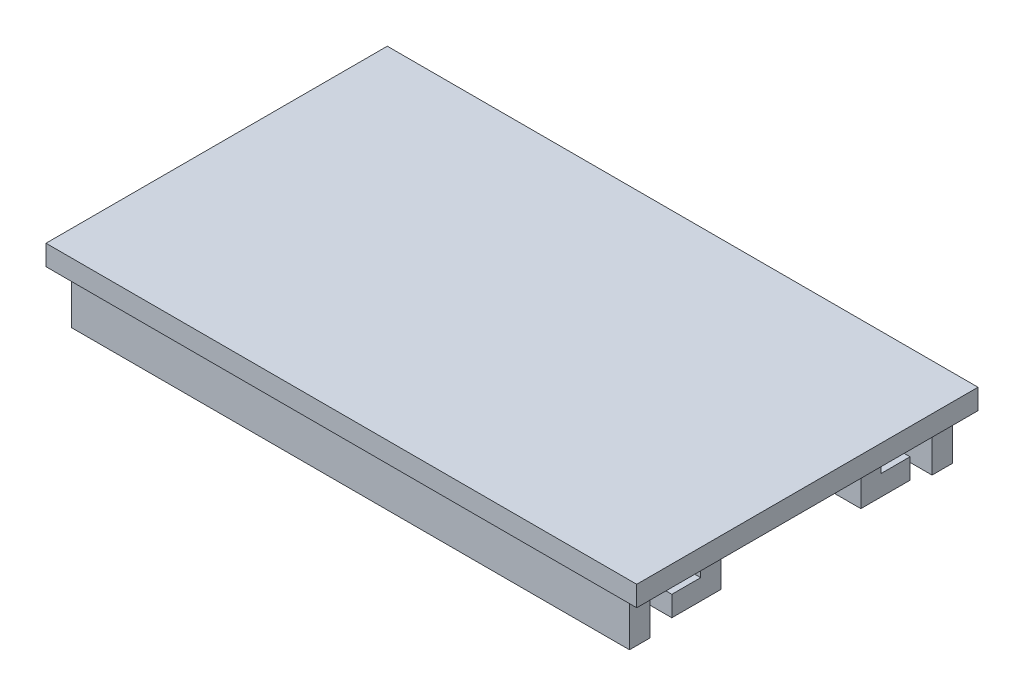
ISO-10303-21;
HEADER;
FILE_DESCRIPTION(('STEP AP214'),'2;1');
FILE_NAME('part.step','',(''),(''),'','','');
FILE_SCHEMA(('AUTOMOTIVE_DESIGN { 1 0 10303 214 1 1 1 1 }'));
ENDSEC;
DATA;
#1=APPLICATION_CONTEXT('core data for automotive mechanical design processes');
#2=APPLICATION_PROTOCOL_DEFINITION('international standard','automotive_design',2000,#1);
#3=PRODUCT_CONTEXT('',#1,'mechanical');
#4=PRODUCT('Part','Part','',(#3));
#5=PRODUCT_RELATED_PRODUCT_CATEGORY('part','',(#4));
#6=PRODUCT_DEFINITION_FORMATION('','',#4);
#7=PRODUCT_DEFINITION_CONTEXT('part definition',#1,'design');
#8=PRODUCT_DEFINITION('design','',#6,#7);
#9=PRODUCT_DEFINITION_SHAPE('','',#8);
#10=(LENGTH_UNIT() NAMED_UNIT(*) SI_UNIT(.MILLI.,.METRE.));
#11=(NAMED_UNIT(*) PLANE_ANGLE_UNIT() SI_UNIT($,.RADIAN.));
#12=(NAMED_UNIT(*) SI_UNIT($,.STERADIAN.) SOLID_ANGLE_UNIT());
#13=UNCERTAINTY_MEASURE_WITH_UNIT(LENGTH_MEASURE(1.E-05),#10,'distance_accuracy_value','');
#14=(GEOMETRIC_REPRESENTATION_CONTEXT(3) GLOBAL_UNCERTAINTY_ASSIGNED_CONTEXT((#13)) GLOBAL_UNIT_ASSIGNED_CONTEXT((#10,
#11,#12)) REPRESENTATION_CONTEXT('',''));
#15=CARTESIAN_POINT('',(0.,0.,0.));
#16=DIRECTION('',(0.,0.,1.));
#17=DIRECTION('',(1.,0.,0.));
#18=AXIS2_PLACEMENT_3D('',#15,#16,#17);
#19=CARTESIAN_POINT('',(0.,0.,0.));
#20=DIRECTION('',(0.,1.,0.));
#21=DIRECTION('',(0.,0.,1.));
#22=AXIS2_PLACEMENT_3D('',#19,#20,#21);
#23=PLANE('',#22);
#24=DIRECTION('',(0.,0.,1.));
#25=VECTOR('',#24,1.);
#26=CARTESIAN_POINT('',(85.,0.,0.));
#27=LINE('',#26,#25);
#28=CARTESIAN_POINT('',(85.,0.,-27.5));
#29=VERTEX_POINT('',#28);
#30=CARTESIAN_POINT('',(85.,0.,-21.3));
#31=VERTEX_POINT('',#30);
#32=EDGE_CURVE('E244',#29,#31,#27,.T.);
#33=ORIENTED_EDGE('',*,*,#32,.F.);
#34=DIRECTION('',(1.,0.,0.));
#35=VECTOR('',#34,1.);
#36=CARTESIAN_POINT('',(-109.849433241279,0.,-27.5));
#37=LINE('',#36,#35);
#38=CARTESIAN_POINT('',(-85.,0.,-27.5));
#39=VERTEX_POINT('',#38);
#40=EDGE_CURVE('E268',#39,#29,#37,.T.);
#41=ORIENTED_EDGE('',*,*,#40,.F.);
#42=DIRECTION('',(0.,0.,-1.));
#43=VECTOR('',#42,1.);
#44=CARTESIAN_POINT('',(-85.,0.,0.));
#45=LINE('',#44,#43);
#46=CARTESIAN_POINT('',(-85.,0.,-21.3));
#47=VERTEX_POINT('',#46);
#48=EDGE_CURVE('E234',#47,#39,#45,.T.);
#49=ORIENTED_EDGE('',*,*,#48,.F.);
#50=DIRECTION('',(1.,0.,0.));
#51=VECTOR('',#50,1.);
#52=CARTESIAN_POINT('',(-109.849433241279,0.,-21.3));
#53=LINE('',#52,#51);
#54=EDGE_CURVE('E230',#47,#31,#53,.T.);
#55=ORIENTED_EDGE('',*,*,#54,.T.);
#56=EDGE_LOOP('',(#33,#41,#49,#55));
#57=FACE_BOUND('',#56,.T.);
#58=DIRECTION('',(0.,0.,1.));
#59=VECTOR('',#58,1.);
#60=CARTESIAN_POINT('',(85.,1.5955765127149E-13,0.));
#61=LINE('',#60,#59);
#62=CARTESIAN_POINT('',(85.,0.,43.));
#63=VERTEX_POINT('',#62);
#64=CARTESIAN_POINT('',(85.,0.,49.2));
#65=VERTEX_POINT('',#64);
#66=EDGE_CURVE('E289',#63,#65,#61,.T.);
#67=ORIENTED_EDGE('',*,*,#66,.F.);
#68=DIRECTION('',(1.,0.,0.));
#69=VECTOR('',#68,1.);
#70=CARTESIAN_POINT('',(-109.849433241279,0.,43.));
#71=LINE('',#70,#69);
#72=CARTESIAN_POINT('',(-85.,0.,43.));
#73=VERTEX_POINT('',#72);
#74=EDGE_CURVE('E324',#73,#63,#71,.T.);
#75=ORIENTED_EDGE('',*,*,#74,.F.);
#76=DIRECTION('',(0.,0.,-1.));
#77=VECTOR('',#76,1.);
#78=CARTESIAN_POINT('',(-85.,1.5955765127149E-13,0.));
#79=LINE('',#78,#77);
#80=CARTESIAN_POINT('',(-85.,0.,49.2));
#81=VERTEX_POINT('',#80);
#82=EDGE_CURVE('E326',#81,#73,#79,.T.);
#83=ORIENTED_EDGE('',*,*,#82,.F.);
#84=DIRECTION('',(1.,0.,0.));
#85=VECTOR('',#84,1.);
#86=CARTESIAN_POINT('',(-109.849433241279,0.,49.2));
#87=LINE('',#86,#85);
#88=EDGE_CURVE('E341',#81,#65,#87,.T.);
#89=ORIENTED_EDGE('',*,*,#88,.T.);
#90=EDGE_LOOP('',(#67,#75,#83,#89));
#91=FACE_BOUND('',#90,.T.);
#92=DIRECTION('',(0.,0.,1.));
#93=VECTOR('',#92,1.);
#94=CARTESIAN_POINT('',(-90.,0.,-52.));
#95=LINE('',#94,#93);
#96=CARTESIAN_POINT('',(-90.,0.,-52.));
#97=VERTEX_POINT('',#96);
#98=CARTESIAN_POINT('',(-90.,0.,52.));
#99=VERTEX_POINT('',#98);
#100=EDGE_CURVE('E351',#97,#99,#95,.T.);
#101=ORIENTED_EDGE('',*,*,#100,.F.);
#102=DIRECTION('',(-1.,0.,0.));
#103=VECTOR('',#102,1.);
#104=CARTESIAN_POINT('',(-90.,0.,-52.));
#105=LINE('',#104,#103);
#106=CARTESIAN_POINT('',(90.,0.,-52.));
#107=VERTEX_POINT('',#106);
#108=EDGE_CURVE('E356',#107,#97,#105,.T.);
#109=ORIENTED_EDGE('',*,*,#108,.F.);
#110=DIRECTION('',(0.,0.,-1.));
#111=VECTOR('',#110,1.);
#112=CARTESIAN_POINT('',(90.,0.,-52.));
#113=LINE('',#112,#111);
#114=CARTESIAN_POINT('',(90.,0.,52.));
#115=VERTEX_POINT('',#114);
#116=EDGE_CURVE('E367',#115,#107,#113,.T.);
#117=ORIENTED_EDGE('',*,*,#116,.F.);
#118=DIRECTION('',(1.,0.,0.));
#119=VECTOR('',#118,1.);
#120=CARTESIAN_POINT('',(-90.,0.,52.));
#121=LINE('',#120,#119);
#122=EDGE_CURVE('E365',#99,#115,#121,.T.);
#123=ORIENTED_EDGE('',*,*,#122,.F.);
#124=EDGE_LOOP('',(#101,#109,#117,#123));
#125=FACE_BOUND('',#124,.T.);
#126=DIRECTION('',(0.,0.,-1.));
#127=VECTOR('',#126,1.);
#128=CARTESIAN_POINT('',(85.,0.,0.));
#129=LINE('',#128,#127);
#130=CARTESIAN_POINT('',(85.,0.,27.5));
#131=VERTEX_POINT('',#130);
#132=CARTESIAN_POINT('',(85.,0.,21.3));
#133=VERTEX_POINT('',#132);
#134=EDGE_CURVE('E295',#131,#133,#129,.T.);
#135=ORIENTED_EDGE('',*,*,#134,.T.);
#136=DIRECTION('',(1.,0.,0.));
#137=VECTOR('',#136,1.);
#138=CARTESIAN_POINT('',(-109.849433241279,0.,21.3));
#139=LINE('',#138,#137);
#140=CARTESIAN_POINT('',(-85.,0.,21.3));
#141=VERTEX_POINT('',#140);
#142=EDGE_CURVE('E312',#141,#133,#139,.T.);
#143=ORIENTED_EDGE('',*,*,#142,.F.);
#144=DIRECTION('',(0.,0.,1.));
#145=VECTOR('',#144,1.);
#146=CARTESIAN_POINT('',(-85.,0.,0.));
#147=LINE('',#146,#145);
#148=CARTESIAN_POINT('',(-85.,0.,27.5));
#149=VERTEX_POINT('',#148);
#150=EDGE_CURVE('E281',#141,#149,#147,.T.);
#151=ORIENTED_EDGE('',*,*,#150,.T.);
#152=DIRECTION('',(1.,0.,0.));
#153=VECTOR('',#152,1.);
#154=CARTESIAN_POINT('',(-109.849433241279,0.,27.5));
#155=LINE('',#154,#153);
#156=EDGE_CURVE('E315',#149,#131,#155,.T.);
#157=ORIENTED_EDGE('',*,*,#156,.T.);
#158=EDGE_LOOP('',(#135,#143,#151,#157));
#159=FACE_BOUND('',#158,.T.);
#160=DIRECTION('',(0.,0.,1.));
#161=VECTOR('',#160,1.);
#162=CARTESIAN_POINT('',(85.,0.,0.));
#163=LINE('',#162,#161);
#164=CARTESIAN_POINT('',(85.,0.,-49.2));
#165=VERTEX_POINT('',#164);
#166=CARTESIAN_POINT('',(85.,0.,-43.));
#167=VERTEX_POINT('',#166);
#168=EDGE_CURVE('E56',#165,#167,#163,.T.);
#169=ORIENTED_EDGE('',*,*,#168,.F.);
#170=DIRECTION('',(1.,0.,0.));
#171=VECTOR('',#170,1.);
#172=CARTESIAN_POINT('',(-109.849433241279,0.,-49.2));
#173=LINE('',#172,#171);
#174=CARTESIAN_POINT('',(-85.,0.,-49.2));
#175=VERTEX_POINT('',#174);
#176=EDGE_CURVE('E207',#175,#165,#173,.T.);
#177=ORIENTED_EDGE('',*,*,#176,.F.);
#178=DIRECTION('',(0.,0.,-1.));
#179=VECTOR('',#178,1.);
#180=CARTESIAN_POINT('',(-85.,0.,0.));
#181=LINE('',#180,#179);
#182=CARTESIAN_POINT('',(-85.,0.,-43.));
#183=VERTEX_POINT('',#182);
#184=EDGE_CURVE('E245',#183,#175,#181,.T.);
#185=ORIENTED_EDGE('',*,*,#184,.F.);
#186=DIRECTION('',(1.,0.,0.));
#187=VECTOR('',#186,1.);
#188=CARTESIAN_POINT('',(-109.849433241279,0.,-43.));
#189=LINE('',#188,#187);
#190=EDGE_CURVE('E51',#183,#167,#189,.T.);
#191=ORIENTED_EDGE('',*,*,#190,.T.);
#192=EDGE_LOOP('',(#169,#177,#185,#191));
#193=FACE_BOUND('',#192,.T.);
#194=ADVANCED_FACE('F36',(#57,#91,#125,#159,#193),#23,.F.);
#195=CARTESIAN_POINT('',(-90.,6.2,-52.));
#196=DIRECTION('',(1.,0.,0.));
#197=DIRECTION('',(0.,0.,-1.));
#198=AXIS2_PLACEMENT_3D('',#195,#196,#197);
#199=PLANE('',#198);
#200=ORIENTED_EDGE('',*,*,#100,.T.);
#201=DIRECTION('',(0.,-1.,0.));
#202=VECTOR('',#201,1.);
#203=CARTESIAN_POINT('',(-90.,6.2,52.));
#204=LINE('',#203,#202);
#205=CARTESIAN_POINT('',(-90.,6.2,52.));
#206=VERTEX_POINT('',#205);
#207=EDGE_CURVE('E12',#206,#99,#204,.T.);
#208=ORIENTED_EDGE('',*,*,#207,.F.);
#209=DIRECTION('',(0.,0.,1.));
#210=VECTOR('',#209,1.);
#211=CARTESIAN_POINT('',(-90.,6.2,-52.));
#212=LINE('',#211,#210);
#213=CARTESIAN_POINT('',(-90.,6.2,-52.));
#214=VERTEX_POINT('',#213);
#215=EDGE_CURVE('E352',#214,#206,#212,.T.);
#216=ORIENTED_EDGE('',*,*,#215,.F.);
#217=DIRECTION('',(0.,-1.,0.));
#218=VECTOR('',#217,1.);
#219=CARTESIAN_POINT('',(-90.,6.2,-52.));
#220=LINE('',#219,#218);
#221=EDGE_CURVE('E362',#214,#97,#220,.T.);
#222=ORIENTED_EDGE('',*,*,#221,.T.);
#223=EDGE_LOOP('',(#200,#208,#216,#222));
#224=FACE_BOUND('',#223,.T.);
#225=ADVANCED_FACE('F38',(#224),#199,.F.);
#226=CARTESIAN_POINT('',(-90.,6.2,52.));
#227=DIRECTION('',(0.,0.,-1.));
#228=DIRECTION('',(-1.,0.,0.));
#229=AXIS2_PLACEMENT_3D('',#226,#227,#228);
#230=PLANE('',#229);
#231=ORIENTED_EDGE('',*,*,#122,.T.);
#232=DIRECTION('',(0.,-1.,0.));
#233=VECTOR('',#232,1.);
#234=CARTESIAN_POINT('',(90.,6.2,52.));
#235=LINE('',#234,#233);
#236=CARTESIAN_POINT('',(90.,6.2,52.));
#237=VERTEX_POINT('',#236);
#238=EDGE_CURVE('E44',#237,#115,#235,.T.);
#239=ORIENTED_EDGE('',*,*,#238,.F.);
#240=DIRECTION('',(1.,0.,0.));
#241=VECTOR('',#240,1.);
#242=CARTESIAN_POINT('',(-90.,6.2,52.));
#243=LINE('',#242,#241);
#244=EDGE_CURVE('E355',#206,#237,#243,.T.);
#245=ORIENTED_EDGE('',*,*,#244,.F.);
#246=ORIENTED_EDGE('',*,*,#207,.T.);
#247=EDGE_LOOP('',(#231,#239,#245,#246));
#248=FACE_BOUND('',#247,.T.);
#249=ADVANCED_FACE('F395',(#248),#230,.F.);
#250=CARTESIAN_POINT('',(90.,6.2,-52.));
#251=DIRECTION('',(-1.,0.,0.));
#252=DIRECTION('',(0.,0.,1.));
#253=AXIS2_PLACEMENT_3D('',#250,#251,#252);
#254=PLANE('',#253);
#255=ORIENTED_EDGE('',*,*,#116,.T.);
#256=DIRECTION('',(0.,-1.,0.));
#257=VECTOR('',#256,1.);
#258=CARTESIAN_POINT('',(90.,6.2,-52.));
#259=LINE('',#258,#257);
#260=CARTESIAN_POINT('',(90.,6.2,-52.));
#261=VERTEX_POINT('',#260);
#262=EDGE_CURVE('E372',#261,#107,#259,.T.);
#263=ORIENTED_EDGE('',*,*,#262,.F.);
#264=DIRECTION('',(0.,0.,-1.));
#265=VECTOR('',#264,1.);
#266=CARTESIAN_POINT('',(90.,6.2,-52.));
#267=LINE('',#266,#265);
#268=EDGE_CURVE('E358',#237,#261,#267,.T.);
#269=ORIENTED_EDGE('',*,*,#268,.F.);
#270=ORIENTED_EDGE('',*,*,#238,.T.);
#271=EDGE_LOOP('',(#255,#263,#269,#270));
#272=FACE_BOUND('',#271,.T.);
#273=ADVANCED_FACE('F379',(#272),#254,.F.);
#274=CARTESIAN_POINT('',(-90.,6.2,-52.));
#275=DIRECTION('',(0.,0.,1.));
#276=DIRECTION('',(1.,0.,0.));
#277=AXIS2_PLACEMENT_3D('',#274,#275,#276);
#278=PLANE('',#277);
#279=ORIENTED_EDGE('',*,*,#108,.T.);
#280=ORIENTED_EDGE('',*,*,#221,.F.);
#281=DIRECTION('',(-1.,0.,0.));
#282=VECTOR('',#281,1.);
#283=CARTESIAN_POINT('',(-90.,6.2,-52.));
#284=LINE('',#283,#282);
#285=EDGE_CURVE('E360',#261,#214,#284,.T.);
#286=ORIENTED_EDGE('',*,*,#285,.F.);
#287=ORIENTED_EDGE('',*,*,#262,.T.);
#288=EDGE_LOOP('',(#279,#280,#286,#287));
#289=FACE_BOUND('',#288,.T.);
#290=ADVANCED_FACE('F388',(#289),#278,.F.);
#291=CARTESIAN_POINT('',(0.,6.2,0.));
#292=DIRECTION('',(0.,1.,0.));
#293=DIRECTION('',(0.,0.,1.));
#294=AXIS2_PLACEMENT_3D('',#291,#292,#293);
#295=PLANE('',#294);
#296=ORIENTED_EDGE('',*,*,#215,.T.);
#297=ORIENTED_EDGE('',*,*,#244,.T.);
#298=ORIENTED_EDGE('',*,*,#268,.T.);
#299=ORIENTED_EDGE('',*,*,#285,.T.);
#300=EDGE_LOOP('',(#296,#297,#298,#299));
#301=FACE_BOUND('',#300,.T.);
#302=ADVANCED_FACE('F394',(#301),#295,.T.);
#303=CARTESIAN_POINT('',(-109.849433241279,0.,43.));
#304=DIRECTION('',(0.,0.,-1.));
#305=DIRECTION('',(-1.,0.,0.));
#306=AXIS2_PLACEMENT_3D('',#303,#304,#305);
#307=PLANE('',#306);
#308=DIRECTION('',(0.,-1.,0.));
#309=VECTOR('',#308,1.);
#310=CARTESIAN_POINT('',(-85.,0.,43.));
#311=LINE('',#310,#309);
#312=CARTESIAN_POINT('',(-85.,-15.,43.));
#313=VERTEX_POINT('',#312);
#314=EDGE_CURVE('E323',#73,#313,#311,.T.);
#315=ORIENTED_EDGE('',*,*,#314,.F.);
#316=ORIENTED_EDGE('',*,*,#74,.T.);
#317=DIRECTION('',(0.,1.,0.));
#318=VECTOR('',#317,1.);
#319=CARTESIAN_POINT('',(85.,0.,43.));
#320=LINE('',#319,#318);
#321=CARTESIAN_POINT('',(85.,-15.,43.));
#322=VERTEX_POINT('',#321);
#323=EDGE_CURVE('E332',#322,#63,#320,.T.);
#324=ORIENTED_EDGE('',*,*,#323,.F.);
#325=DIRECTION('',(1.,0.,0.));
#326=VECTOR('',#325,1.);
#327=CARTESIAN_POINT('',(-109.849433241279,-15.,43.));
#328=LINE('',#327,#326);
#329=EDGE_CURVE('E345',#313,#322,#328,.T.);
#330=ORIENTED_EDGE('',*,*,#329,.F.);
#331=EDGE_LOOP('',(#315,#316,#324,#330));
#332=FACE_BOUND('',#331,.T.);
#333=ADVANCED_FACE('F415',(#332),#307,.T.);
#334=CARTESIAN_POINT('',(-109.849433241279,-14.9999999999997,0.));
#335=DIRECTION('',(0.,-1.,0.));
#336=DIRECTION('',(0.,0.,-1.));
#337=AXIS2_PLACEMENT_3D('',#334,#335,#336);
#338=PLANE('',#337);
#339=DIRECTION('',(0.,0.,1.));
#340=VECTOR('',#339,1.);
#341=CARTESIAN_POINT('',(-85.,-14.9999999999997,0.));
#342=LINE('',#341,#340);
#343=CARTESIAN_POINT('',(-85.,-15.,49.2));
#344=VERTEX_POINT('',#343);
#345=EDGE_CURVE('E321',#313,#344,#342,.T.);
#346=ORIENTED_EDGE('',*,*,#345,.F.);
#347=ORIENTED_EDGE('',*,*,#329,.T.);
#348=DIRECTION('',(0.,0.,-1.));
#349=VECTOR('',#348,1.);
#350=CARTESIAN_POINT('',(85.,-14.9999999999997,0.));
#351=LINE('',#350,#349);
#352=CARTESIAN_POINT('',(85.,-15.,49.2));
#353=VERTEX_POINT('',#352);
#354=EDGE_CURVE('E335',#353,#322,#351,.T.);
#355=ORIENTED_EDGE('',*,*,#354,.F.);
#356=DIRECTION('',(1.,0.,0.));
#357=VECTOR('',#356,1.);
#358=CARTESIAN_POINT('',(-109.849433241279,-15.,49.2));
#359=LINE('',#358,#357);
#360=EDGE_CURVE('E343',#344,#353,#359,.T.);
#361=ORIENTED_EDGE('',*,*,#360,.F.);
#362=EDGE_LOOP('',(#346,#347,#355,#361));
#363=FACE_BOUND('',#362,.T.);
#364=ADVANCED_FACE('F419',(#363),#338,.T.);
#365=CARTESIAN_POINT('',(-109.849433241279,0.,49.2));
#366=DIRECTION('',(0.,0.,1.));
#367=DIRECTION('',(1.,0.,0.));
#368=AXIS2_PLACEMENT_3D('',#365,#366,#367);
#369=PLANE('',#368);
#370=DIRECTION('',(0.,1.,0.));
#371=VECTOR('',#370,1.);
#372=CARTESIAN_POINT('',(-85.,0.,49.2));
#373=LINE('',#372,#371);
#374=EDGE_CURVE('E329',#344,#81,#373,.T.);
#375=ORIENTED_EDGE('',*,*,#374,.F.);
#376=ORIENTED_EDGE('',*,*,#360,.T.);
#377=DIRECTION('',(0.,-1.,0.));
#378=VECTOR('',#377,1.);
#379=CARTESIAN_POINT('',(85.,0.,49.2));
#380=LINE('',#379,#378);
#381=EDGE_CURVE('E338',#65,#353,#380,.T.);
#382=ORIENTED_EDGE('',*,*,#381,.F.);
#383=ORIENTED_EDGE('',*,*,#88,.F.);
#384=EDGE_LOOP('',(#375,#376,#382,#383));
#385=FACE_BOUND('',#384,.T.);
#386=ADVANCED_FACE('F424',(#385),#369,.T.);
#387=CARTESIAN_POINT('',(85.,0.,0.));
#388=DIRECTION('',(-1.,0.,0.));
#389=DIRECTION('',(0.,0.,1.));
#390=AXIS2_PLACEMENT_3D('',#387,#388,#389);
#391=PLANE('',#390);
#392=ORIENTED_EDGE('',*,*,#66,.T.);
#393=ORIENTED_EDGE('',*,*,#381,.T.);
#394=ORIENTED_EDGE('',*,*,#354,.T.);
#395=ORIENTED_EDGE('',*,*,#323,.T.);
#396=EDGE_LOOP('',(#392,#393,#394,#395));
#397=FACE_BOUND('',#396,.T.);
#398=ADVANCED_FACE('F431',(#397),#391,.F.);
#399=CARTESIAN_POINT('',(-85.,6.2,-52.));
#400=DIRECTION('',(1.,0.,0.));
#401=DIRECTION('',(0.,0.,-1.));
#402=AXIS2_PLACEMENT_3D('',#399,#400,#401);
#403=PLANE('',#402);
#404=ORIENTED_EDGE('',*,*,#82,.T.);
#405=ORIENTED_EDGE('',*,*,#314,.T.);
#406=ORIENTED_EDGE('',*,*,#345,.T.);
#407=ORIENTED_EDGE('',*,*,#374,.T.);
#408=EDGE_LOOP('',(#404,#405,#406,#407));
#409=FACE_BOUND('',#408,.T.);
#410=ADVANCED_FACE('F435',(#409),#403,.F.);
#411=CARTESIAN_POINT('',(85.,0.,0.));
#412=DIRECTION('',(-1.,0.,0.));
#413=DIRECTION('',(0.,0.,1.));
#414=AXIS2_PLACEMENT_3D('',#411,#412,#413);
#415=PLANE('',#414);
#416=DIRECTION('',(0.,0.,-1.));
#417=VECTOR('',#416,1.);
#418=CARTESIAN_POINT('',(85.,-6.8,0.));
#419=LINE('',#418,#417);
#420=CARTESIAN_POINT('',(85.,-6.8,36.3));
#421=VERTEX_POINT('',#420);
#422=CARTESIAN_POINT('',(85.,-6.8,27.5));
#423=VERTEX_POINT('',#422);
#424=EDGE_CURVE('E273',#421,#423,#419,.T.);
#425=ORIENTED_EDGE('',*,*,#424,.F.);
#426=DIRECTION('',(0.,1.,0.));
#427=VECTOR('',#426,1.);
#428=CARTESIAN_POINT('',(85.,0.,36.3));
#429=LINE('',#428,#427);
#430=CARTESIAN_POINT('',(85.,-13.,36.3));
#431=VERTEX_POINT('',#430);
#432=EDGE_CURVE('E303',#431,#421,#429,.T.);
#433=ORIENTED_EDGE('',*,*,#432,.F.);
#434=DIRECTION('',(0.,0.,1.));
#435=VECTOR('',#434,1.);
#436=CARTESIAN_POINT('',(85.,-13.,0.));
#437=LINE('',#436,#435);
#438=CARTESIAN_POINT('',(85.,-13.,21.3));
#439=VERTEX_POINT('',#438);
#440=EDGE_CURVE('E300',#439,#431,#437,.T.);
#441=ORIENTED_EDGE('',*,*,#440,.F.);
#442=DIRECTION('',(0.,-1.,0.));
#443=VECTOR('',#442,1.);
#444=CARTESIAN_POINT('',(85.,0.,21.3));
#445=LINE('',#444,#443);
#446=EDGE_CURVE('E297',#133,#439,#445,.T.);
#447=ORIENTED_EDGE('',*,*,#446,.F.);
#448=ORIENTED_EDGE('',*,*,#134,.F.);
#449=DIRECTION('',(0.,1.,0.));
#450=VECTOR('',#449,1.);
#451=CARTESIAN_POINT('',(85.,0.,27.5));
#452=LINE('',#451,#450);
#453=EDGE_CURVE('E292',#423,#131,#452,.T.);
#454=ORIENTED_EDGE('',*,*,#453,.F.);
#455=EDGE_LOOP('',(#425,#433,#441,#447,#448,#454));
#456=FACE_BOUND('',#455,.T.);
#457=ADVANCED_FACE('F439',(#456),#415,.F.);
#458=CARTESIAN_POINT('',(-109.849433241279,0.,36.3));
#459=DIRECTION('',(0.,0.,-1.));
#460=DIRECTION('',(-1.,0.,0.));
#461=AXIS2_PLACEMENT_3D('',#458,#459,#460);
#462=PLANE('',#461);
#463=DIRECTION('',(1.,0.,0.));
#464=VECTOR('',#463,1.);
#465=CARTESIAN_POINT('',(-109.849433241279,-6.8,36.3));
#466=LINE('',#465,#464);
#467=CARTESIAN_POINT('',(-85.,-6.8,36.3));
#468=VERTEX_POINT('',#467);
#469=EDGE_CURVE('E306',#468,#421,#466,.T.);
#470=ORIENTED_EDGE('',*,*,#469,.F.);
#471=DIRECTION('',(0.,-1.,0.));
#472=VECTOR('',#471,1.);
#473=CARTESIAN_POINT('',(-85.,0.,36.3));
#474=LINE('',#473,#472);
#475=CARTESIAN_POINT('',(-85.,-13.,36.3));
#476=VERTEX_POINT('',#475);
#477=EDGE_CURVE('E278',#468,#476,#474,.T.);
#478=ORIENTED_EDGE('',*,*,#477,.T.);
#479=DIRECTION('',(1.,0.,0.));
#480=VECTOR('',#479,1.);
#481=CARTESIAN_POINT('',(-109.849433241279,-13.,36.3));
#482=LINE('',#481,#480);
#483=EDGE_CURVE('E308',#476,#431,#482,.T.);
#484=ORIENTED_EDGE('',*,*,#483,.T.);
#485=ORIENTED_EDGE('',*,*,#432,.T.);
#486=EDGE_LOOP('',(#470,#478,#484,#485));
#487=FACE_BOUND('',#486,.T.);
#488=ADVANCED_FACE('F457',(#487),#462,.F.);
#489=CARTESIAN_POINT('',(-109.849433241279,-13.,0.));
#490=DIRECTION('',(0.,1.,0.));
#491=DIRECTION('',(0.,0.,1.));
#492=AXIS2_PLACEMENT_3D('',#489,#490,#491);
#493=PLANE('',#492);
#494=ORIENTED_EDGE('',*,*,#483,.F.);
#495=DIRECTION('',(0.,0.,-1.));
#496=VECTOR('',#495,1.);
#497=CARTESIAN_POINT('',(-85.,-13.,0.));
#498=LINE('',#497,#496);
#499=CARTESIAN_POINT('',(-85.,-13.,21.3));
#500=VERTEX_POINT('',#499);
#501=EDGE_CURVE('E274',#476,#500,#498,.T.);
#502=ORIENTED_EDGE('',*,*,#501,.T.);
#503=DIRECTION('',(1.,0.,0.));
#504=VECTOR('',#503,1.);
#505=CARTESIAN_POINT('',(-109.849433241279,-13.,21.3));
#506=LINE('',#505,#504);
#507=EDGE_CURVE('E310',#500,#439,#506,.T.);
#508=ORIENTED_EDGE('',*,*,#507,.T.);
#509=ORIENTED_EDGE('',*,*,#440,.T.);
#510=EDGE_LOOP('',(#494,#502,#508,#509));
#511=FACE_BOUND('',#510,.T.);
#512=ADVANCED_FACE('F453',(#511),#493,.F.);
#513=CARTESIAN_POINT('',(-109.849433241279,0.,21.3));
#514=DIRECTION('',(0.,0.,1.));
#515=DIRECTION('',(1.,0.,0.));
#516=AXIS2_PLACEMENT_3D('',#513,#514,#515);
#517=PLANE('',#516);
#518=ORIENTED_EDGE('',*,*,#507,.F.);
#519=DIRECTION('',(0.,1.,0.));
#520=VECTOR('',#519,1.);
#521=CARTESIAN_POINT('',(-85.,0.,21.3));
#522=LINE('',#521,#520);
#523=EDGE_CURVE('E277',#500,#141,#522,.T.);
#524=ORIENTED_EDGE('',*,*,#523,.T.);
#525=ORIENTED_EDGE('',*,*,#142,.T.);
#526=ORIENTED_EDGE('',*,*,#446,.T.);
#527=EDGE_LOOP('',(#518,#524,#525,#526));
#528=FACE_BOUND('',#527,.T.);
#529=ADVANCED_FACE('F449',(#528),#517,.F.);
#530=CARTESIAN_POINT('',(-109.849433241279,0.,27.5));
#531=DIRECTION('',(0.,0.,-1.));
#532=DIRECTION('',(0.,1.,0.));
#533=AXIS2_PLACEMENT_3D('',#530,#531,#532);
#534=PLANE('',#533);
#535=ORIENTED_EDGE('',*,*,#156,.F.);
#536=DIRECTION('',(0.,-1.,0.));
#537=VECTOR('',#536,1.);
#538=CARTESIAN_POINT('',(-85.,0.,27.5));
#539=LINE('',#538,#537);
#540=CARTESIAN_POINT('',(-85.,-6.8,27.5));
#541=VERTEX_POINT('',#540);
#542=EDGE_CURVE('E283',#149,#541,#539,.T.);
#543=ORIENTED_EDGE('',*,*,#542,.T.);
#544=DIRECTION('',(1.,0.,0.));
#545=VECTOR('',#544,1.);
#546=CARTESIAN_POINT('',(-109.849433241279,-6.8,27.5));
#547=LINE('',#546,#545);
#548=EDGE_CURVE('E317',#541,#423,#547,.T.);
#549=ORIENTED_EDGE('',*,*,#548,.T.);
#550=ORIENTED_EDGE('',*,*,#453,.T.);
#551=EDGE_LOOP('',(#535,#543,#549,#550));
#552=FACE_BOUND('',#551,.T.);
#553=ADVANCED_FACE('F445',(#552),#534,.F.);
#554=CARTESIAN_POINT('',(-109.849433241279,-6.8,0.));
#555=DIRECTION('',(0.,-1.,0.));
#556=DIRECTION('',(0.,0.,-1.));
#557=AXIS2_PLACEMENT_3D('',#554,#555,#556);
#558=PLANE('',#557);
#559=ORIENTED_EDGE('',*,*,#548,.F.);
#560=DIRECTION('',(0.,0.,1.));
#561=VECTOR('',#560,1.);
#562=CARTESIAN_POINT('',(-85.,-6.8,0.));
#563=LINE('',#562,#561);
#564=EDGE_CURVE('E286',#541,#468,#563,.T.);
#565=ORIENTED_EDGE('',*,*,#564,.T.);
#566=ORIENTED_EDGE('',*,*,#469,.T.);
#567=ORIENTED_EDGE('',*,*,#424,.T.);
#568=EDGE_LOOP('',(#559,#565,#566,#567));
#569=FACE_BOUND('',#568,.T.);
#570=ADVANCED_FACE('F441',(#569),#558,.F.);
#571=CARTESIAN_POINT('',(-85.,6.2,-52.));
#572=DIRECTION('',(1.,0.,0.));
#573=DIRECTION('',(0.,0.,-1.));
#574=AXIS2_PLACEMENT_3D('',#571,#572,#573);
#575=PLANE('',#574);
#576=ORIENTED_EDGE('',*,*,#542,.F.);
#577=ORIENTED_EDGE('',*,*,#150,.F.);
#578=ORIENTED_EDGE('',*,*,#523,.F.);
#579=ORIENTED_EDGE('',*,*,#501,.F.);
#580=ORIENTED_EDGE('',*,*,#477,.F.);
#581=ORIENTED_EDGE('',*,*,#564,.F.);
#582=EDGE_LOOP('',(#576,#577,#578,#579,#580,#581));
#583=FACE_BOUND('',#582,.T.);
#584=ADVANCED_FACE('F444',(#583),#575,.F.);
#585=CARTESIAN_POINT('',(-109.849433241279,0.,-21.3));
#586=DIRECTION('',(0.,0.,1.));
#587=DIRECTION('',(1.,0.,0.));
#588=AXIS2_PLACEMENT_3D('',#585,#586,#587);
#589=PLANE('',#588);
#590=DIRECTION('',(0.,1.,0.));
#591=VECTOR('',#590,1.);
#592=CARTESIAN_POINT('',(-85.,0.,-21.3));
#593=LINE('',#592,#591);
#594=CARTESIAN_POINT('',(-85.,-13.,-21.3));
#595=VERTEX_POINT('',#594);
#596=EDGE_CURVE('E237',#595,#47,#593,.T.);
#597=ORIENTED_EDGE('',*,*,#596,.F.);
#598=DIRECTION('',(1.,0.,0.));
#599=VECTOR('',#598,1.);
#600=CARTESIAN_POINT('',(-109.849433241279,-13.,-21.3));
#601=LINE('',#600,#599);
#602=CARTESIAN_POINT('',(85.,-13.,-21.3));
#603=VERTEX_POINT('',#602);
#604=EDGE_CURVE('E260',#595,#603,#601,.T.);
#605=ORIENTED_EDGE('',*,*,#604,.T.);
#606=DIRECTION('',(0.,-1.,0.));
#607=VECTOR('',#606,1.);
#608=CARTESIAN_POINT('',(85.,0.,-21.3));
#609=LINE('',#608,#607);
#610=EDGE_CURVE('E241',#31,#603,#609,.T.);
#611=ORIENTED_EDGE('',*,*,#610,.F.);
#612=ORIENTED_EDGE('',*,*,#54,.F.);
#613=EDGE_LOOP('',(#597,#605,#611,#612));
#614=FACE_BOUND('',#613,.T.);
#615=ADVANCED_FACE('F467',(#614),#589,.T.);
#616=CARTESIAN_POINT('',(-109.849433241279,0.,-27.5));
#617=DIRECTION('',(0.,0.,-1.));
#618=DIRECTION('',(0.,1.,0.));
#619=AXIS2_PLACEMENT_3D('',#616,#617,#618);
#620=PLANE('',#619);
#621=DIRECTION('',(0.,-1.,0.));
#622=VECTOR('',#621,1.);
#623=CARTESIAN_POINT('',(-85.,0.,-27.5));
#624=LINE('',#623,#622);
#625=CARTESIAN_POINT('',(-85.,-6.80000000000001,-27.5));
#626=VERTEX_POINT('',#625);
#627=EDGE_CURVE('E232',#39,#626,#624,.T.);
#628=ORIENTED_EDGE('',*,*,#627,.F.);
#629=ORIENTED_EDGE('',*,*,#40,.T.);
#630=DIRECTION('',(0.,1.,0.));
#631=VECTOR('',#630,1.);
#632=CARTESIAN_POINT('',(85.,0.,-27.5));
#633=LINE('',#632,#631);
#634=CARTESIAN_POINT('',(85.,-6.80000000000001,-27.5));
#635=VERTEX_POINT('',#634);
#636=EDGE_CURVE('E248',#635,#29,#633,.T.);
#637=ORIENTED_EDGE('',*,*,#636,.F.);
#638=DIRECTION('',(1.,0.,0.));
#639=VECTOR('',#638,1.);
#640=CARTESIAN_POINT('',(-109.849433241279,-6.80000000000001,-27.5));
#641=LINE('',#640,#639);
#642=EDGE_CURVE('E266',#626,#635,#641,.T.);
#643=ORIENTED_EDGE('',*,*,#642,.F.);
#644=EDGE_LOOP('',(#628,#629,#637,#643));
#645=FACE_BOUND('',#644,.T.);
#646=ADVANCED_FACE('F471',(#645),#620,.T.);
#647=CARTESIAN_POINT('',(-109.849433241279,-6.8,0.));
#648=DIRECTION('',(0.,1.,0.));
#649=DIRECTION('',(0.,0.,1.));
#650=AXIS2_PLACEMENT_3D('',#647,#648,#649);
#651=PLANE('',#650);
#652=DIRECTION('',(0.,0.,-1.));
#653=VECTOR('',#652,1.);
#654=CARTESIAN_POINT('',(-85.,-6.8,0.));
#655=LINE('',#654,#653);
#656=CARTESIAN_POINT('',(-85.,-6.80000000000001,-36.3));
#657=VERTEX_POINT('',#656);
#658=EDGE_CURVE('E229',#626,#657,#655,.T.);
#659=ORIENTED_EDGE('',*,*,#658,.F.);
#660=ORIENTED_EDGE('',*,*,#642,.T.);
#661=DIRECTION('',(0.,0.,1.));
#662=VECTOR('',#661,1.);
#663=CARTESIAN_POINT('',(85.,-6.8,0.));
#664=LINE('',#663,#662);
#665=CARTESIAN_POINT('',(85.,-6.80000000000001,-36.3));
#666=VERTEX_POINT('',#665);
#667=EDGE_CURVE('E251',#666,#635,#664,.T.);
#668=ORIENTED_EDGE('',*,*,#667,.F.);
#669=DIRECTION('',(1.,0.,0.));
#670=VECTOR('',#669,1.);
#671=CARTESIAN_POINT('',(-109.849433241279,-6.80000000000001,-36.3));
#672=LINE('',#671,#670);
#673=EDGE_CURVE('E264',#657,#666,#672,.T.);
#674=ORIENTED_EDGE('',*,*,#673,.F.);
#675=EDGE_LOOP('',(#659,#660,#668,#674));
#676=FACE_BOUND('',#675,.T.);
#677=ADVANCED_FACE('F475',(#676),#651,.T.);
#678=CARTESIAN_POINT('',(-109.849433241279,0.,-36.3));
#679=DIRECTION('',(0.,0.,-1.));
#680=DIRECTION('',(-1.,0.,0.));
#681=AXIS2_PLACEMENT_3D('',#678,#679,#680);
#682=PLANE('',#681);
#683=DIRECTION('',(0.,-1.,0.));
#684=VECTOR('',#683,1.);
#685=CARTESIAN_POINT('',(-85.,0.,-36.3));
#686=LINE('',#685,#684);
#687=CARTESIAN_POINT('',(-85.,-13.,-36.3));
#688=VERTEX_POINT('',#687);
#689=EDGE_CURVE('E227',#657,#688,#686,.T.);
#690=ORIENTED_EDGE('',*,*,#689,.F.);
#691=ORIENTED_EDGE('',*,*,#673,.T.);
#692=DIRECTION('',(0.,1.,0.));
#693=VECTOR('',#692,1.);
#694=CARTESIAN_POINT('',(85.,0.,-36.3));
#695=LINE('',#694,#693);
#696=CARTESIAN_POINT('',(85.,-13.,-36.3));
#697=VERTEX_POINT('',#696);
#698=EDGE_CURVE('E254',#697,#666,#695,.T.);
#699=ORIENTED_EDGE('',*,*,#698,.F.);
#700=DIRECTION('',(1.,0.,0.));
#701=VECTOR('',#700,1.);
#702=CARTESIAN_POINT('',(-109.849433241279,-13.,-36.3));
#703=LINE('',#702,#701);
#704=EDGE_CURVE('E262',#688,#697,#703,.T.);
#705=ORIENTED_EDGE('',*,*,#704,.F.);
#706=EDGE_LOOP('',(#690,#691,#699,#705));
#707=FACE_BOUND('',#706,.T.);
#708=ADVANCED_FACE('F479',(#707),#682,.T.);
#709=CARTESIAN_POINT('',(-109.849433241279,-13.,0.));
#710=DIRECTION('',(0.,-1.,0.));
#711=DIRECTION('',(0.,0.,-1.));
#712=AXIS2_PLACEMENT_3D('',#709,#710,#711);
#713=PLANE('',#712);
#714=DIRECTION('',(0.,0.,1.));
#715=VECTOR('',#714,1.);
#716=CARTESIAN_POINT('',(-85.,-13.,0.));
#717=LINE('',#716,#715);
#718=EDGE_CURVE('E240',#688,#595,#717,.T.);
#719=ORIENTED_EDGE('',*,*,#718,.F.);
#720=ORIENTED_EDGE('',*,*,#704,.T.);
#721=DIRECTION('',(0.,0.,-1.));
#722=VECTOR('',#721,1.);
#723=CARTESIAN_POINT('',(85.,-13.,0.));
#724=LINE('',#723,#722);
#725=EDGE_CURVE('E257',#603,#697,#724,.T.);
#726=ORIENTED_EDGE('',*,*,#725,.F.);
#727=ORIENTED_EDGE('',*,*,#604,.F.);
#728=EDGE_LOOP('',(#719,#720,#726,#727));
#729=FACE_BOUND('',#728,.T.);
#730=ADVANCED_FACE('F483',(#729),#713,.T.);
#731=CARTESIAN_POINT('',(85.,0.,0.));
#732=DIRECTION('',(-1.,0.,0.));
#733=DIRECTION('',(0.,0.,1.));
#734=AXIS2_PLACEMENT_3D('',#731,#732,#733);
#735=PLANE('',#734);
#736=ORIENTED_EDGE('',*,*,#610,.T.);
#737=ORIENTED_EDGE('',*,*,#725,.T.);
#738=ORIENTED_EDGE('',*,*,#698,.T.);
#739=ORIENTED_EDGE('',*,*,#667,.T.);
#740=ORIENTED_EDGE('',*,*,#636,.T.);
#741=ORIENTED_EDGE('',*,*,#32,.T.);
#742=EDGE_LOOP('',(#736,#737,#738,#739,#740,#741));
#743=FACE_BOUND('',#742,.T.);
#744=ADVANCED_FACE('F487',(#743),#735,.F.);
#745=CARTESIAN_POINT('',(-85.,6.2,-52.));
#746=DIRECTION('',(1.,0.,0.));
#747=DIRECTION('',(0.,0.,-1.));
#748=AXIS2_PLACEMENT_3D('',#745,#746,#747);
#749=PLANE('',#748);
#750=ORIENTED_EDGE('',*,*,#596,.T.);
#751=ORIENTED_EDGE('',*,*,#48,.T.);
#752=ORIENTED_EDGE('',*,*,#627,.T.);
#753=ORIENTED_EDGE('',*,*,#658,.T.);
#754=ORIENTED_EDGE('',*,*,#689,.T.);
#755=ORIENTED_EDGE('',*,*,#718,.T.);
#756=EDGE_LOOP('',(#750,#751,#752,#753,#754,#755));
#757=FACE_BOUND('',#756,.T.);
#758=ADVANCED_FACE('F491',(#757),#749,.F.);
#759=CARTESIAN_POINT('',(85.,0.,0.));
#760=DIRECTION('',(-1.,0.,0.));
#761=DIRECTION('',(0.,0.,1.));
#762=AXIS2_PLACEMENT_3D('',#759,#760,#761);
#763=PLANE('',#762);
#764=ORIENTED_EDGE('',*,*,#168,.T.);
#765=DIRECTION('',(0.,1.,0.));
#766=VECTOR('',#765,1.);
#767=CARTESIAN_POINT('',(85.,0.,-43.));
#768=LINE('',#767,#766);
#769=CARTESIAN_POINT('',(85.,-15.,-43.));
#770=VERTEX_POINT('',#769);
#771=EDGE_CURVE('E216',#770,#167,#768,.T.);
#772=ORIENTED_EDGE('',*,*,#771,.F.);
#773=DIRECTION('',(0.,0.,1.));
#774=VECTOR('',#773,1.);
#775=CARTESIAN_POINT('',(85.,-14.9999999999997,1.00725879250264E-13));
#776=LINE('',#775,#774);
#777=CARTESIAN_POINT('',(85.,-15.,-49.2));
#778=VERTEX_POINT('',#777);
#779=EDGE_CURVE('E202',#778,#770,#776,.T.);
#780=ORIENTED_EDGE('',*,*,#779,.F.);
#781=DIRECTION('',(0.,-1.,0.));
#782=VECTOR('',#781,1.);
#783=CARTESIAN_POINT('',(85.,0.,-49.2));
#784=LINE('',#783,#782);
#785=EDGE_CURVE('E211',#165,#778,#784,.T.);
#786=ORIENTED_EDGE('',*,*,#785,.F.);
#787=EDGE_LOOP('',(#764,#772,#780,#786));
#788=FACE_BOUND('',#787,.T.);
#789=ADVANCED_FACE('F215',(#788),#763,.F.);
#790=CARTESIAN_POINT('',(-109.849433241279,0.,-43.));
#791=DIRECTION('',(0.,0.,-1.));
#792=DIRECTION('',(-1.,0.,0.));
#793=AXIS2_PLACEMENT_3D('',#790,#791,#792);
#794=PLANE('',#793);
#795=ORIENTED_EDGE('',*,*,#190,.F.);
#796=DIRECTION('',(0.,-1.,0.));
#797=VECTOR('',#796,1.);
#798=CARTESIAN_POINT('',(-85.,0.,-43.));
#799=LINE('',#798,#797);
#800=CARTESIAN_POINT('',(-85.,-15.,-43.));
#801=VERTEX_POINT('',#800);
#802=EDGE_CURVE('E224',#183,#801,#799,.T.);
#803=ORIENTED_EDGE('',*,*,#802,.T.);
#804=DIRECTION('',(1.,0.,0.));
#805=VECTOR('',#804,1.);
#806=CARTESIAN_POINT('',(-109.849433241279,-15.,-43.));
#807=LINE('',#806,#805);
#808=EDGE_CURVE('E208',#801,#770,#807,.T.);
#809=ORIENTED_EDGE('',*,*,#808,.T.);
#810=ORIENTED_EDGE('',*,*,#771,.T.);
#811=EDGE_LOOP('',(#795,#803,#809,#810));
#812=FACE_BOUND('',#811,.T.);
#813=ADVANCED_FACE('F501',(#812),#794,.F.);
#814=CARTESIAN_POINT('',(-109.849433241279,-14.9999999999997,1.00725879250264E-13));
#815=DIRECTION('',(0.,1.,0.));
#816=DIRECTION('',(0.,0.,1.));
#817=AXIS2_PLACEMENT_3D('',#814,#815,#816);
#818=PLANE('',#817);
#819=ORIENTED_EDGE('',*,*,#808,.F.);
#820=DIRECTION('',(0.,0.,-1.));
#821=VECTOR('',#820,1.);
#822=CARTESIAN_POINT('',(-85.,-14.9999999999997,1.00725879250264E-13));
#823=LINE('',#822,#821);
#824=CARTESIAN_POINT('',(-85.,-15.,-49.2));
#825=VERTEX_POINT('',#824);
#826=EDGE_CURVE('E204',#801,#825,#823,.T.);
#827=ORIENTED_EDGE('',*,*,#826,.T.);
#828=DIRECTION('',(1.,0.,0.));
#829=VECTOR('',#828,1.);
#830=CARTESIAN_POINT('',(-109.849433241279,-15.,-49.2));
#831=LINE('',#830,#829);
#832=EDGE_CURVE('E197',#825,#778,#831,.T.);
#833=ORIENTED_EDGE('',*,*,#832,.T.);
#834=ORIENTED_EDGE('',*,*,#779,.T.);
#835=EDGE_LOOP('',(#819,#827,#833,#834));
#836=FACE_BOUND('',#835,.T.);
#837=ADVANCED_FACE('F200',(#836),#818,.F.);
#838=CARTESIAN_POINT('',(-109.849433241279,0.,-49.2));
#839=DIRECTION('',(0.,0.,1.));
#840=DIRECTION('',(1.,0.,0.));
#841=AXIS2_PLACEMENT_3D('',#838,#839,#840);
#842=PLANE('',#841);
#843=ORIENTED_EDGE('',*,*,#832,.F.);
#844=DIRECTION('',(0.,1.,0.));
#845=VECTOR('',#844,1.);
#846=CARTESIAN_POINT('',(-85.,0.,-49.2));
#847=LINE('',#846,#845);
#848=EDGE_CURVE('E513',#825,#175,#847,.T.);
#849=ORIENTED_EDGE('',*,*,#848,.T.);
#850=ORIENTED_EDGE('',*,*,#176,.T.);
#851=ORIENTED_EDGE('',*,*,#785,.T.);
#852=EDGE_LOOP('',(#843,#849,#850,#851));
#853=FACE_BOUND('',#852,.T.);
#854=ADVANCED_FACE('F212',(#853),#842,.F.);
#855=CARTESIAN_POINT('',(-85.,6.2,-52.));
#856=DIRECTION('',(1.,0.,0.));
#857=DIRECTION('',(0.,0.,-1.));
#858=AXIS2_PLACEMENT_3D('',#855,#856,#857);
#859=PLANE('',#858);
#860=ORIENTED_EDGE('',*,*,#184,.T.);
#861=ORIENTED_EDGE('',*,*,#848,.F.);
#862=ORIENTED_EDGE('',*,*,#826,.F.);
#863=ORIENTED_EDGE('',*,*,#802,.F.);
#864=EDGE_LOOP('',(#860,#861,#862,#863));
#865=FACE_BOUND('',#864,.T.);
#866=ADVANCED_FACE('F498',(#865),#859,.F.);
#867=CLOSED_SHELL('',(#194,#225,#249,#273,#290,#302,#333,#364,#386,#398,#410,#457,#488,#512,
#529,#553,#570,#584,#615,#646,#677,#708,#730,#744,#758,#789,#813,#837,#854,#866));
#868=MANIFOLD_SOLID_BREP('B2',#867);
#869=ADVANCED_BREP_SHAPE_REPRESENTATION('',(#18,#868),#14);
#870=SHAPE_DEFINITION_REPRESENTATION(#9,#869);
ENDSEC;
END-ISO-10303-21;
